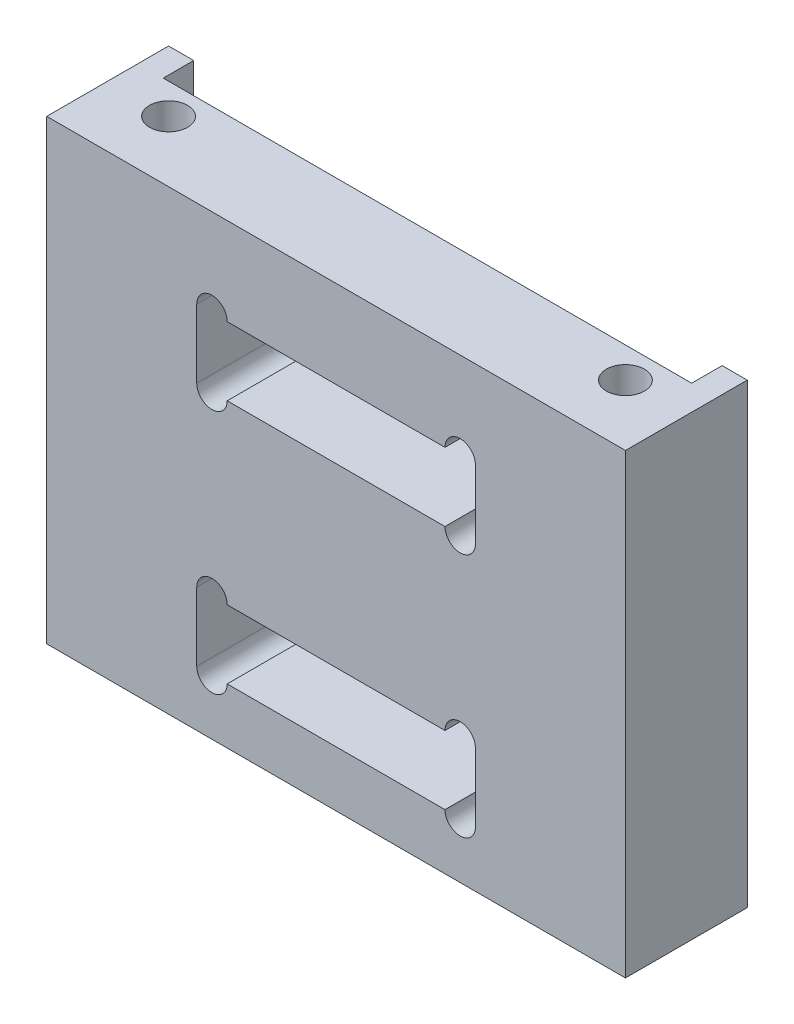
ISO-10303-21;
HEADER;
FILE_DESCRIPTION(('STEP AP214'),'2;1');
FILE_NAME('part.step','',(''),(''),'','','');
FILE_SCHEMA(('AUTOMOTIVE_DESIGN { 1 0 10303 214 1 1 1 1 }'));
ENDSEC;
DATA;
#1=APPLICATION_CONTEXT('core data for automotive mechanical design processes');
#2=APPLICATION_PROTOCOL_DEFINITION('international standard','automotive_design',2000,#1);
#3=PRODUCT_CONTEXT('',#1,'mechanical');
#4=PRODUCT('Part','Part','',(#3));
#5=PRODUCT_RELATED_PRODUCT_CATEGORY('part','',(#4));
#6=PRODUCT_DEFINITION_FORMATION('','',#4);
#7=PRODUCT_DEFINITION_CONTEXT('part definition',#1,'design');
#8=PRODUCT_DEFINITION('design','',#6,#7);
#9=PRODUCT_DEFINITION_SHAPE('','',#8);
#10=(LENGTH_UNIT() NAMED_UNIT(*) SI_UNIT(.MILLI.,.METRE.));
#11=(NAMED_UNIT(*) PLANE_ANGLE_UNIT() SI_UNIT($,.RADIAN.));
#12=(NAMED_UNIT(*) SI_UNIT($,.STERADIAN.) SOLID_ANGLE_UNIT());
#13=UNCERTAINTY_MEASURE_WITH_UNIT(LENGTH_MEASURE(1.E-05),#10,'distance_accuracy_value','');
#14=(GEOMETRIC_REPRESENTATION_CONTEXT(3) GLOBAL_UNCERTAINTY_ASSIGNED_CONTEXT((#13)) GLOBAL_UNIT_ASSIGNED_CONTEXT((#10,
#11,#12)) REPRESENTATION_CONTEXT('',''));
#15=CARTESIAN_POINT('',(0.,0.,0.));
#16=DIRECTION('',(0.,0.,1.));
#17=DIRECTION('',(1.,0.,0.));
#18=AXIS2_PLACEMENT_3D('',#15,#16,#17);
#19=CARTESIAN_POINT('',(19.,-15.,4.));
#20=DIRECTION('',(0.,1.,0.));
#21=DIRECTION('',(-1.,0.,0.));
#22=AXIS2_PLACEMENT_3D('',#19,#20,#21);
#23=PLANE('',#22);
#24=CARTESIAN_POINT('',(-14.5,-15.,0.));
#25=DIRECTION('',(0.,-1.,0.));
#26=DIRECTION('',(0.,0.,-1.));
#27=AXIS2_PLACEMENT_3D('',#24,#25,#26);
#28=CIRCLE('',#27,1.25);
#29=CARTESIAN_POINT('',(-14.5,-15.,-1.25));
#30=VERTEX_POINT('',#29);
#31=EDGE_CURVE('E235',#30,#30,#28,.T.);
#32=ORIENTED_EDGE('',*,*,#31,.F.);
#33=EDGE_LOOP('',(#32));
#34=FACE_BOUND('',#33,.T.);
#35=CARTESIAN_POINT('',(14.5,-15.,0.));
#36=DIRECTION('',(0.,-1.,0.));
#37=DIRECTION('',(0.,0.,-1.));
#38=AXIS2_PLACEMENT_3D('',#35,#36,#37);
#39=CIRCLE('',#38,1.25);
#40=CARTESIAN_POINT('',(14.5,-15.,-1.25));
#41=VERTEX_POINT('',#40);
#42=EDGE_CURVE('E241',#41,#41,#39,.T.);
#43=ORIENTED_EDGE('',*,*,#42,.F.);
#44=EDGE_LOOP('',(#43));
#45=FACE_BOUND('',#44,.T.);
#46=DIRECTION('',(0.,0.,-1.));
#47=VECTOR('',#46,1.);
#48=CARTESIAN_POINT('',(17.35,-15.,-2.));
#49=LINE('',#48,#47);
#50=CARTESIAN_POINT('',(17.35,-15.,-2.));
#51=VERTEX_POINT('',#50);
#52=CARTESIAN_POINT('',(17.35,-15.,-4.));
#53=VERTEX_POINT('',#52);
#54=EDGE_CURVE('E380',#51,#53,#49,.T.);
#55=ORIENTED_EDGE('',*,*,#54,.T.);
#56=DIRECTION('',(1.,0.,0.));
#57=VECTOR('',#56,1.);
#58=CARTESIAN_POINT('',(19.,-15.,-4.));
#59=LINE('',#58,#57);
#60=CARTESIAN_POINT('',(19.,-15.,-4.));
#61=VERTEX_POINT('',#60);
#62=EDGE_CURVE('E405',#53,#61,#59,.T.);
#63=ORIENTED_EDGE('',*,*,#62,.T.);
#64=DIRECTION('',(0.,0.,-1.));
#65=VECTOR('',#64,1.);
#66=CARTESIAN_POINT('',(19.,-15.,4.));
#67=LINE('',#66,#65);
#68=CARTESIAN_POINT('',(19.,-15.,4.));
#69=VERTEX_POINT('',#68);
#70=EDGE_CURVE('E419',#69,#61,#67,.T.);
#71=ORIENTED_EDGE('',*,*,#70,.F.);
#72=DIRECTION('',(1.,0.,0.));
#73=VECTOR('',#72,1.);
#74=CARTESIAN_POINT('',(19.,-15.,4.));
#75=LINE('',#74,#73);
#76=CARTESIAN_POINT('',(-19.,-15.,4.));
#77=VERTEX_POINT('',#76);
#78=EDGE_CURVE('E395',#77,#69,#75,.T.);
#79=ORIENTED_EDGE('',*,*,#78,.F.);
#80=DIRECTION('',(0.,0.,-1.));
#81=VECTOR('',#80,1.);
#82=CARTESIAN_POINT('',(-19.,-15.,4.));
#83=LINE('',#82,#81);
#84=CARTESIAN_POINT('',(-19.,-15.,-4.));
#85=VERTEX_POINT('',#84);
#86=EDGE_CURVE('E422',#77,#85,#83,.T.);
#87=ORIENTED_EDGE('',*,*,#86,.T.);
#88=CARTESIAN_POINT('',(-17.35,-15.,-4.));
#89=VERTEX_POINT('',#88);
#90=EDGE_CURVE('E406',#85,#89,#59,.T.);
#91=ORIENTED_EDGE('',*,*,#90,.T.);
#92=DIRECTION('',(0.,0.,-1.));
#93=VECTOR('',#92,1.);
#94=CARTESIAN_POINT('',(-17.35,-15.,-2.));
#95=LINE('',#94,#93);
#96=CARTESIAN_POINT('',(-17.35,-15.,-2.));
#97=VERTEX_POINT('',#96);
#98=EDGE_CURVE('E385',#97,#89,#95,.T.);
#99=ORIENTED_EDGE('',*,*,#98,.F.);
#100=DIRECTION('',(1.,0.,0.));
#101=VECTOR('',#100,1.);
#102=CARTESIAN_POINT('',(17.35,-15.,-2.));
#103=LINE('',#102,#101);
#104=EDGE_CURVE('E374',#97,#51,#103,.T.);
#105=ORIENTED_EDGE('',*,*,#104,.T.);
#106=EDGE_LOOP('',(#55,#63,#71,#79,#87,#91,#99,#105));
#107=FACE_BOUND('',#106,.T.);
#108=ADVANCED_FACE('F44',(#34,#45,#107),#23,.F.);
#109=CARTESIAN_POINT('',(19.,15.,4.));
#110=DIRECTION('',(0.,-1.,0.));
#111=DIRECTION('',(1.,0.,0.));
#112=AXIS2_PLACEMENT_3D('',#109,#110,#111);
#113=PLANE('',#112);
#114=CARTESIAN_POINT('',(15.,15.,0.));
#115=DIRECTION('',(0.,1.,0.));
#116=DIRECTION('',(0.,0.,1.));
#117=AXIS2_PLACEMENT_3D('',#114,#115,#116);
#118=CIRCLE('',#117,1.25);
#119=CARTESIAN_POINT('',(15.,15.,1.25));
#120=VERTEX_POINT('',#119);
#121=EDGE_CURVE('E225',#120,#120,#118,.T.);
#122=ORIENTED_EDGE('',*,*,#121,.F.);
#123=EDGE_LOOP('',(#122));
#124=FACE_BOUND('',#123,.T.);
#125=CARTESIAN_POINT('',(-15.,15.,0.));
#126=DIRECTION('',(0.,1.,0.));
#127=DIRECTION('',(0.,0.,1.));
#128=AXIS2_PLACEMENT_3D('',#125,#126,#127);
#129=CIRCLE('',#128,1.25);
#130=CARTESIAN_POINT('',(-15.,15.,1.25));
#131=VERTEX_POINT('',#130);
#132=EDGE_CURVE('E224',#131,#131,#129,.T.);
#133=ORIENTED_EDGE('',*,*,#132,.F.);
#134=EDGE_LOOP('',(#133));
#135=FACE_BOUND('',#134,.T.);
#136=DIRECTION('',(0.,0.,-1.));
#137=VECTOR('',#136,1.);
#138=CARTESIAN_POINT('',(17.35,15.,4.));
#139=LINE('',#138,#137);
#140=CARTESIAN_POINT('',(17.35,15.,-2.));
#141=VERTEX_POINT('',#140);
#142=CARTESIAN_POINT('',(17.35,15.,-4.));
#143=VERTEX_POINT('',#142);
#144=EDGE_CURVE('E389',#141,#143,#139,.T.);
#145=ORIENTED_EDGE('',*,*,#144,.F.);
#146=DIRECTION('',(1.,0.,0.));
#147=VECTOR('',#146,1.);
#148=CARTESIAN_POINT('',(19.,15.,-2.));
#149=LINE('',#148,#147);
#150=CARTESIAN_POINT('',(-17.35,15.,-2.));
#151=VERTEX_POINT('',#150);
#152=EDGE_CURVE('E11',#151,#141,#149,.T.);
#153=ORIENTED_EDGE('',*,*,#152,.F.);
#154=DIRECTION('',(0.,0.,1.));
#155=VECTOR('',#154,1.);
#156=CARTESIAN_POINT('',(-17.35,15.,4.));
#157=LINE('',#156,#155);
#158=CARTESIAN_POINT('',(-17.35,15.,-4.));
#159=VERTEX_POINT('',#158);
#160=EDGE_CURVE('E387',#159,#151,#157,.T.);
#161=ORIENTED_EDGE('',*,*,#160,.F.);
#162=DIRECTION('',(-1.,0.,0.));
#163=VECTOR('',#162,1.);
#164=CARTESIAN_POINT('',(19.,15.,-4.));
#165=LINE('',#164,#163);
#166=CARTESIAN_POINT('',(-19.,15.,-4.));
#167=VERTEX_POINT('',#166);
#168=EDGE_CURVE('E411',#159,#167,#165,.T.);
#169=ORIENTED_EDGE('',*,*,#168,.T.);
#170=DIRECTION('',(0.,0.,-1.));
#171=VECTOR('',#170,1.);
#172=CARTESIAN_POINT('',(-19.,15.,4.));
#173=LINE('',#172,#171);
#174=CARTESIAN_POINT('',(-19.,15.,4.));
#175=VERTEX_POINT('',#174);
#176=EDGE_CURVE('E402',#175,#167,#173,.T.);
#177=ORIENTED_EDGE('',*,*,#176,.F.);
#178=DIRECTION('',(-1.,0.,0.));
#179=VECTOR('',#178,1.);
#180=CARTESIAN_POINT('',(19.,15.,4.));
#181=LINE('',#180,#179);
#182=CARTESIAN_POINT('',(19.,15.,4.));
#183=VERTEX_POINT('',#182);
#184=EDGE_CURVE('E400',#183,#175,#181,.T.);
#185=ORIENTED_EDGE('',*,*,#184,.F.);
#186=DIRECTION('',(0.,0.,-1.));
#187=VECTOR('',#186,1.);
#188=CARTESIAN_POINT('',(19.,15.,4.));
#189=LINE('',#188,#187);
#190=CARTESIAN_POINT('',(19.,15.,-4.));
#191=VERTEX_POINT('',#190);
#192=EDGE_CURVE('E416',#183,#191,#189,.T.);
#193=ORIENTED_EDGE('',*,*,#192,.T.);
#194=EDGE_CURVE('E396',#191,#143,#165,.T.);
#195=ORIENTED_EDGE('',*,*,#194,.T.);
#196=EDGE_LOOP('',(#145,#153,#161,#169,#177,#185,#193,#195));
#197=FACE_BOUND('',#196,.T.);
#198=ADVANCED_FACE('F435',(#124,#135,#197),#113,.F.);
#199=CARTESIAN_POINT('',(0.,0.,-4.));
#200=DIRECTION('',(0.,0.,1.));
#201=DIRECTION('',(1.,0.,0.));
#202=AXIS2_PLACEMENT_3D('',#199,#200,#201);
#203=PLANE('',#202);
#204=DIRECTION('',(0.,1.,0.));
#205=VECTOR('',#204,1.);
#206=CARTESIAN_POINT('',(17.35,15.5,-4.));
#207=LINE('',#206,#205);
#208=EDGE_CURVE('E297',#53,#143,#207,.T.);
#209=ORIENTED_EDGE('',*,*,#208,.T.);
#210=ORIENTED_EDGE('',*,*,#194,.F.);
#211=DIRECTION('',(0.,1.,0.));
#212=VECTOR('',#211,1.);
#213=CARTESIAN_POINT('',(19.,-15.,-4.));
#214=LINE('',#213,#212);
#215=EDGE_CURVE('E409',#61,#191,#214,.T.);
#216=ORIENTED_EDGE('',*,*,#215,.F.);
#217=ORIENTED_EDGE('',*,*,#62,.F.);
#218=EDGE_LOOP('',(#209,#210,#216,#217));
#219=FACE_BOUND('',#218,.T.);
#220=ADVANCED_FACE('F454',(#219),#203,.F.);
#221=DIRECTION('',(0.,1.,0.));
#222=VECTOR('',#221,1.);
#223=CARTESIAN_POINT('',(-17.35,0.,-4.));
#224=LINE('',#223,#222);
#225=EDGE_CURVE('E52',#89,#159,#224,.T.);
#226=ORIENTED_EDGE('',*,*,#225,.F.);
#227=ORIENTED_EDGE('',*,*,#90,.F.);
#228=DIRECTION('',(0.,-1.,0.));
#229=VECTOR('',#228,1.);
#230=CARTESIAN_POINT('',(-19.,-15.,-4.));
#231=LINE('',#230,#229);
#232=EDGE_CURVE('E391',#167,#85,#231,.T.);
#233=ORIENTED_EDGE('',*,*,#232,.F.);
#234=ORIENTED_EDGE('',*,*,#168,.F.);
#235=EDGE_LOOP('',(#226,#227,#233,#234));
#236=FACE_BOUND('',#235,.T.);
#237=ADVANCED_FACE('F438',(#236),#203,.F.);
#238=CARTESIAN_POINT('',(-19.,-15.,4.));
#239=DIRECTION('',(1.,0.,0.));
#240=DIRECTION('',(0.,0.,-1.));
#241=AXIS2_PLACEMENT_3D('',#238,#239,#240);
#242=PLANE('',#241);
#243=ORIENTED_EDGE('',*,*,#232,.T.);
#244=ORIENTED_EDGE('',*,*,#86,.F.);
#245=DIRECTION('',(0.,-1.,0.));
#246=VECTOR('',#245,1.);
#247=CARTESIAN_POINT('',(-19.,-15.,4.));
#248=LINE('',#247,#246);
#249=EDGE_CURVE('E392',#175,#77,#248,.T.);
#250=ORIENTED_EDGE('',*,*,#249,.F.);
#251=ORIENTED_EDGE('',*,*,#176,.T.);
#252=EDGE_LOOP('',(#243,#244,#250,#251));
#253=FACE_BOUND('',#252,.T.);
#254=ADVANCED_FACE('F46',(#253),#242,.F.);
#255=CARTESIAN_POINT('',(19.,-15.,4.));
#256=DIRECTION('',(-1.,0.,0.));
#257=DIRECTION('',(0.,0.,1.));
#258=AXIS2_PLACEMENT_3D('',#255,#256,#257);
#259=PLANE('',#258);
#260=ORIENTED_EDGE('',*,*,#215,.T.);
#261=ORIENTED_EDGE('',*,*,#192,.F.);
#262=DIRECTION('',(0.,1.,0.));
#263=VECTOR('',#262,1.);
#264=CARTESIAN_POINT('',(19.,-15.,4.));
#265=LINE('',#264,#263);
#266=EDGE_CURVE('E398',#69,#183,#265,.T.);
#267=ORIENTED_EDGE('',*,*,#266,.F.);
#268=ORIENTED_EDGE('',*,*,#70,.T.);
#269=EDGE_LOOP('',(#260,#261,#267,#268));
#270=FACE_BOUND('',#269,.T.);
#271=ADVANCED_FACE('F450',(#270),#259,.F.);
#272=CARTESIAN_POINT('',(0.,0.,4.));
#273=DIRECTION('',(0.,0.,1.));
#274=DIRECTION('',(1.,0.,0.));
#275=AXIS2_PLACEMENT_3D('',#272,#273,#274);
#276=PLANE('',#275);
#277=CARTESIAN_POINT('',(-8.15,-6.85000000000001,4.));
#278=DIRECTION('',(0.,0.,-1.));
#279=DIRECTION('',(-1.,0.,0.));
#280=AXIS2_PLACEMENT_3D('',#277,#278,#279);
#281=CIRCLE('',#280,0.999999999999997);
#282=CARTESIAN_POINT('',(-9.15,-6.85000000000001,4.));
#283=VERTEX_POINT('',#282);
#284=CARTESIAN_POINT('',(-7.15,-6.85000000000001,4.));
#285=VERTEX_POINT('',#284);
#286=EDGE_CURVE('E248',#283,#285,#281,.T.);
#287=ORIENTED_EDGE('',*,*,#286,.T.);
#288=DIRECTION('',(1.,0.,0.));
#289=VECTOR('',#288,1.);
#290=CARTESIAN_POINT('',(7.15000000000001,-6.85000000000001,4.));
#291=LINE('',#290,#289);
#292=CARTESIAN_POINT('',(7.15000000000001,-6.85000000000001,4.));
#293=VERTEX_POINT('',#292);
#294=EDGE_CURVE('E251',#285,#293,#291,.T.);
#295=ORIENTED_EDGE('',*,*,#294,.T.);
#296=CARTESIAN_POINT('',(8.15,-6.85000000000001,4.));
#297=DIRECTION('',(0.,0.,-1.));
#298=DIRECTION('',(1.,0.,0.));
#299=AXIS2_PLACEMENT_3D('',#296,#297,#298);
#300=CIRCLE('',#299,0.999999999999996);
#301=CARTESIAN_POINT('',(9.15,-6.85000000000001,4.));
#302=VERTEX_POINT('',#301);
#303=EDGE_CURVE('E59',#293,#302,#300,.T.);
#304=ORIENTED_EDGE('',*,*,#303,.T.);
#305=DIRECTION('',(0.,-1.,0.));
#306=VECTOR('',#305,1.);
#307=CARTESIAN_POINT('',(9.15,-11.35,4.));
#308=LINE('',#307,#306);
#309=CARTESIAN_POINT('',(9.15,-11.35,4.));
#310=VERTEX_POINT('',#309);
#311=EDGE_CURVE('E256',#302,#310,#308,.T.);
#312=ORIENTED_EDGE('',*,*,#311,.T.);
#313=CARTESIAN_POINT('',(8.15,-11.35,4.));
#314=DIRECTION('',(0.,0.,-1.));
#315=DIRECTION('',(-1.,0.,0.));
#316=AXIS2_PLACEMENT_3D('',#313,#314,#315);
#317=CIRCLE('',#316,0.999999999999996);
#318=CARTESIAN_POINT('',(7.15000000000001,-11.35,4.));
#319=VERTEX_POINT('',#318);
#320=EDGE_CURVE('E259',#310,#319,#317,.T.);
#321=ORIENTED_EDGE('',*,*,#320,.T.);
#322=DIRECTION('',(-1.,0.,0.));
#323=VECTOR('',#322,1.);
#324=CARTESIAN_POINT('',(-7.15,-11.35,4.));
#325=LINE('',#324,#323);
#326=CARTESIAN_POINT('',(-7.15,-11.35,4.));
#327=VERTEX_POINT('',#326);
#328=EDGE_CURVE('E262',#319,#327,#325,.T.);
#329=ORIENTED_EDGE('',*,*,#328,.T.);
#330=CARTESIAN_POINT('',(-8.15,-11.35,4.));
#331=DIRECTION('',(0.,0.,-1.));
#332=DIRECTION('',(1.,0.,0.));
#333=AXIS2_PLACEMENT_3D('',#330,#331,#332);
#334=CIRCLE('',#333,0.999999999999997);
#335=CARTESIAN_POINT('',(-9.15,-11.35,4.));
#336=VERTEX_POINT('',#335);
#337=EDGE_CURVE('E265',#327,#336,#334,.T.);
#338=ORIENTED_EDGE('',*,*,#337,.T.);
#339=DIRECTION('',(0.,1.,0.));
#340=VECTOR('',#339,1.);
#341=CARTESIAN_POINT('',(-9.15,-6.85000000000001,4.));
#342=LINE('',#341,#340);
#343=EDGE_CURVE('E268',#336,#283,#342,.T.);
#344=ORIENTED_EDGE('',*,*,#343,.T.);
#345=EDGE_LOOP('',(#287,#295,#304,#312,#321,#329,#338,#344));
#346=FACE_BOUND('',#345,.T.);
#347=CARTESIAN_POINT('',(-8.15,9.24999999999999,4.));
#348=DIRECTION('',(0.,0.,-1.));
#349=DIRECTION('',(-1.,0.,0.));
#350=AXIS2_PLACEMENT_3D('',#347,#348,#349);
#351=CIRCLE('',#350,1.);
#352=CARTESIAN_POINT('',(-9.15,9.24999999999999,4.));
#353=VERTEX_POINT('',#352);
#354=CARTESIAN_POINT('',(-7.15,9.24999999999999,4.));
#355=VERTEX_POINT('',#354);
#356=EDGE_CURVE('E333',#353,#355,#351,.T.);
#357=ORIENTED_EDGE('',*,*,#356,.T.);
#358=DIRECTION('',(1.,0.,0.));
#359=VECTOR('',#358,1.);
#360=CARTESIAN_POINT('',(7.15,9.24999999999999,4.));
#361=LINE('',#360,#359);
#362=CARTESIAN_POINT('',(7.15,9.24999999999999,4.));
#363=VERTEX_POINT('',#362);
#364=EDGE_CURVE('E367',#355,#363,#361,.T.);
#365=ORIENTED_EDGE('',*,*,#364,.T.);
#366=CARTESIAN_POINT('',(8.15,9.24999999999999,4.));
#367=DIRECTION('',(0.,0.,-1.));
#368=DIRECTION('',(1.,0.,0.));
#369=AXIS2_PLACEMENT_3D('',#366,#367,#368);
#370=CIRCLE('',#369,1.);
#371=CARTESIAN_POINT('',(9.15,9.24999999999999,4.));
#372=VERTEX_POINT('',#371);
#373=EDGE_CURVE('E67',#363,#372,#370,.T.);
#374=ORIENTED_EDGE('',*,*,#373,.T.);
#375=DIRECTION('',(0.,-1.,0.));
#376=VECTOR('',#375,1.);
#377=CARTESIAN_POINT('',(9.15,4.74999999999999,4.));
#378=LINE('',#377,#376);
#379=CARTESIAN_POINT('',(9.15,4.74999999999999,4.));
#380=VERTEX_POINT('',#379);
#381=EDGE_CURVE('E363',#372,#380,#378,.T.);
#382=ORIENTED_EDGE('',*,*,#381,.T.);
#383=CARTESIAN_POINT('',(8.15,4.74999999999999,4.));
#384=DIRECTION('',(0.,0.,-1.));
#385=DIRECTION('',(-1.,0.,0.));
#386=AXIS2_PLACEMENT_3D('',#383,#384,#385);
#387=CIRCLE('',#386,0.999999999999999);
#388=CARTESIAN_POINT('',(7.15,4.74999999999999,4.));
#389=VERTEX_POINT('',#388);
#390=EDGE_CURVE('E360',#380,#389,#387,.T.);
#391=ORIENTED_EDGE('',*,*,#390,.T.);
#392=DIRECTION('',(-1.,0.,0.));
#393=VECTOR('',#392,1.);
#394=CARTESIAN_POINT('',(-7.15,4.74999999999999,4.));
#395=LINE('',#394,#393);
#396=CARTESIAN_POINT('',(-7.15,4.74999999999999,4.));
#397=VERTEX_POINT('',#396);
#398=EDGE_CURVE('E357',#389,#397,#395,.T.);
#399=ORIENTED_EDGE('',*,*,#398,.T.);
#400=CARTESIAN_POINT('',(-8.15,4.74999999999999,4.));
#401=DIRECTION('',(0.,0.,-1.));
#402=DIRECTION('',(1.,0.,0.));
#403=AXIS2_PLACEMENT_3D('',#400,#401,#402);
#404=CIRCLE('',#403,0.999999999999999);
#405=CARTESIAN_POINT('',(-9.15,4.74999999999999,4.));
#406=VERTEX_POINT('',#405);
#407=EDGE_CURVE('E354',#397,#406,#404,.T.);
#408=ORIENTED_EDGE('',*,*,#407,.T.);
#409=DIRECTION('',(0.,1.,0.));
#410=VECTOR('',#409,1.);
#411=CARTESIAN_POINT('',(-9.15,9.24999999999999,4.));
#412=LINE('',#411,#410);
#413=EDGE_CURVE('E315',#406,#353,#412,.T.);
#414=ORIENTED_EDGE('',*,*,#413,.T.);
#415=EDGE_LOOP('',(#357,#365,#374,#382,#391,#399,#408,#414));
#416=FACE_BOUND('',#415,.T.);
#417=ORIENTED_EDGE('',*,*,#249,.T.);
#418=ORIENTED_EDGE('',*,*,#78,.T.);
#419=ORIENTED_EDGE('',*,*,#266,.T.);
#420=ORIENTED_EDGE('',*,*,#184,.T.);
#421=EDGE_LOOP('',(#417,#418,#419,#420));
#422=FACE_BOUND('',#421,.T.);
#423=ADVANCED_FACE('F446',(#346,#416,#422),#276,.T.);
#424=CARTESIAN_POINT('',(15.85,15.5,-2.));
#425=DIRECTION('',(0.,0.,-1.));
#426=DIRECTION('',(-1.,0.,0.));
#427=AXIS2_PLACEMENT_3D('',#424,#425,#426);
#428=PLANE('',#427);
#429=CARTESIAN_POINT('',(-8.15,-6.85000000000001,-2.));
#430=DIRECTION('',(0.,0.,-1.));
#431=DIRECTION('',(-1.,0.,0.));
#432=AXIS2_PLACEMENT_3D('',#429,#430,#431);
#433=CIRCLE('',#432,0.999999999999997);
#434=CARTESIAN_POINT('',(-9.15,-6.85000000000001,-2.));
#435=VERTEX_POINT('',#434);
#436=CARTESIAN_POINT('',(-7.15,-6.85,-2.));
#437=VERTEX_POINT('',#436);
#438=EDGE_CURVE('E272',#435,#437,#433,.T.);
#439=ORIENTED_EDGE('',*,*,#438,.F.);
#440=DIRECTION('',(0.,1.,0.));
#441=VECTOR('',#440,1.);
#442=CARTESIAN_POINT('',(-9.15,-6.85000000000001,-2.));
#443=LINE('',#442,#441);
#444=CARTESIAN_POINT('',(-9.15,-11.35,-2.));
#445=VERTEX_POINT('',#444);
#446=EDGE_CURVE('E252',#445,#435,#443,.T.);
#447=ORIENTED_EDGE('',*,*,#446,.F.);
#448=CARTESIAN_POINT('',(-8.15,-11.35,-2.));
#449=DIRECTION('',(0.,0.,-1.));
#450=DIRECTION('',(1.,0.,0.));
#451=AXIS2_PLACEMENT_3D('',#448,#449,#450);
#452=CIRCLE('',#451,0.999999999999997);
#453=CARTESIAN_POINT('',(-7.15,-11.35,-2.));
#454=VERTEX_POINT('',#453);
#455=EDGE_CURVE('E290',#454,#445,#452,.T.);
#456=ORIENTED_EDGE('',*,*,#455,.F.);
#457=DIRECTION('',(-1.,0.,0.));
#458=VECTOR('',#457,1.);
#459=CARTESIAN_POINT('',(-7.15,-11.35,-2.));
#460=LINE('',#459,#458);
#461=CARTESIAN_POINT('',(7.15000000000001,-11.35,-2.));
#462=VERTEX_POINT('',#461);
#463=EDGE_CURVE('E287',#462,#454,#460,.T.);
#464=ORIENTED_EDGE('',*,*,#463,.F.);
#465=CARTESIAN_POINT('',(8.15,-11.35,-2.));
#466=DIRECTION('',(0.,0.,-1.));
#467=DIRECTION('',(-1.,0.,0.));
#468=AXIS2_PLACEMENT_3D('',#465,#466,#467);
#469=CIRCLE('',#468,0.999999999999996);
#470=CARTESIAN_POINT('',(9.15,-11.35,-2.));
#471=VERTEX_POINT('',#470);
#472=EDGE_CURVE('E284',#471,#462,#469,.T.);
#473=ORIENTED_EDGE('',*,*,#472,.F.);
#474=DIRECTION('',(0.,-1.,0.));
#475=VECTOR('',#474,1.);
#476=CARTESIAN_POINT('',(9.15,-11.35,-2.));
#477=LINE('',#476,#475);
#478=CARTESIAN_POINT('',(9.15,-6.85000000000001,-2.));
#479=VERTEX_POINT('',#478);
#480=EDGE_CURVE('E281',#479,#471,#477,.T.);
#481=ORIENTED_EDGE('',*,*,#480,.F.);
#482=CARTESIAN_POINT('',(8.15,-6.85000000000001,-2.));
#483=DIRECTION('',(0.,0.,-1.));
#484=DIRECTION('',(1.,0.,0.));
#485=AXIS2_PLACEMENT_3D('',#482,#483,#484);
#486=CIRCLE('',#485,0.999999999999996);
#487=CARTESIAN_POINT('',(7.15000000000001,-6.85000000000001,-2.));
#488=VERTEX_POINT('',#487);
#489=EDGE_CURVE('E278',#488,#479,#486,.T.);
#490=ORIENTED_EDGE('',*,*,#489,.F.);
#491=DIRECTION('',(1.,0.,0.));
#492=VECTOR('',#491,1.);
#493=CARTESIAN_POINT('',(7.15000000000001,-6.85000000000001,-2.));
#494=LINE('',#493,#492);
#495=EDGE_CURVE('E274',#437,#488,#494,.T.);
#496=ORIENTED_EDGE('',*,*,#495,.F.);
#497=EDGE_LOOP('',(#439,#447,#456,#464,#473,#481,#490,#496));
#498=FACE_BOUND('',#497,.T.);
#499=CARTESIAN_POINT('',(-8.15,9.24999999999999,-2.));
#500=DIRECTION('',(0.,0.,-1.));
#501=DIRECTION('',(-1.,0.,0.));
#502=AXIS2_PLACEMENT_3D('',#499,#500,#501);
#503=CIRCLE('',#502,1.);
#504=CARTESIAN_POINT('',(-9.15,9.24999999999999,-2.));
#505=VERTEX_POINT('',#504);
#506=CARTESIAN_POINT('',(-7.15,9.24999999999999,-2.));
#507=VERTEX_POINT('',#506);
#508=EDGE_CURVE('E275',#505,#507,#503,.T.);
#509=ORIENTED_EDGE('',*,*,#508,.F.);
#510=DIRECTION('',(0.,1.,0.));
#511=VECTOR('',#510,1.);
#512=CARTESIAN_POINT('',(-9.15,9.24999999999999,-2.));
#513=LINE('',#512,#511);
#514=CARTESIAN_POINT('',(-9.15,4.74999999999999,-2.));
#515=VERTEX_POINT('',#514);
#516=EDGE_CURVE('E329',#515,#505,#513,.T.);
#517=ORIENTED_EDGE('',*,*,#516,.F.);
#518=CARTESIAN_POINT('',(-8.15,4.74999999999999,-2.));
#519=DIRECTION('',(0.,0.,-1.));
#520=DIRECTION('',(1.,0.,0.));
#521=AXIS2_PLACEMENT_3D('',#518,#519,#520);
#522=CIRCLE('',#521,0.999999999999999);
#523=CARTESIAN_POINT('',(-7.15,4.74999999999999,-2.));
#524=VERTEX_POINT('',#523);
#525=EDGE_CURVE('E332',#524,#515,#522,.T.);
#526=ORIENTED_EDGE('',*,*,#525,.F.);
#527=DIRECTION('',(-1.,0.,0.));
#528=VECTOR('',#527,1.);
#529=CARTESIAN_POINT('',(-7.15,4.74999999999999,-2.));
#530=LINE('',#529,#528);
#531=CARTESIAN_POINT('',(7.15,4.74999999999999,-2.));
#532=VERTEX_POINT('',#531);
#533=EDGE_CURVE('E336',#532,#524,#530,.T.);
#534=ORIENTED_EDGE('',*,*,#533,.F.);
#535=CARTESIAN_POINT('',(8.15,4.74999999999999,-2.));
#536=DIRECTION('',(0.,0.,-1.));
#537=DIRECTION('',(-1.,0.,0.));
#538=AXIS2_PLACEMENT_3D('',#535,#536,#537);
#539=CIRCLE('',#538,0.999999999999999);
#540=CARTESIAN_POINT('',(9.15,4.74999999999999,-2.));
#541=VERTEX_POINT('',#540);
#542=EDGE_CURVE('E339',#541,#532,#539,.T.);
#543=ORIENTED_EDGE('',*,*,#542,.F.);
#544=DIRECTION('',(0.,-1.,0.));
#545=VECTOR('',#544,1.);
#546=CARTESIAN_POINT('',(9.15,4.74999999999999,-2.));
#547=LINE('',#546,#545);
#548=CARTESIAN_POINT('',(9.15,9.24999999999999,-2.));
#549=VERTEX_POINT('',#548);
#550=EDGE_CURVE('E342',#549,#541,#547,.T.);
#551=ORIENTED_EDGE('',*,*,#550,.F.);
#552=CARTESIAN_POINT('',(8.15,9.24999999999999,-2.));
#553=DIRECTION('',(0.,0.,-1.));
#554=DIRECTION('',(1.,0.,0.));
#555=AXIS2_PLACEMENT_3D('',#552,#553,#554);
#556=CIRCLE('',#555,1.);
#557=CARTESIAN_POINT('',(7.15,9.24999999999999,-2.));
#558=VERTEX_POINT('',#557);
#559=EDGE_CURVE('E345',#558,#549,#556,.T.);
#560=ORIENTED_EDGE('',*,*,#559,.F.);
#561=DIRECTION('',(1.,0.,0.));
#562=VECTOR('',#561,1.);
#563=CARTESIAN_POINT('',(7.15,9.24999999999999,-2.));
#564=LINE('',#563,#562);
#565=EDGE_CURVE('E348',#507,#558,#564,.T.);
#566=ORIENTED_EDGE('',*,*,#565,.F.);
#567=EDGE_LOOP('',(#509,#517,#526,#534,#543,#551,#560,#566));
#568=FACE_BOUND('',#567,.T.);
#569=ORIENTED_EDGE('',*,*,#152,.T.);
#570=DIRECTION('',(0.,1.,0.));
#571=VECTOR('',#570,1.);
#572=CARTESIAN_POINT('',(17.35,-13.2,-2.));
#573=LINE('',#572,#571);
#574=EDGE_CURVE('E377',#51,#141,#573,.T.);
#575=ORIENTED_EDGE('',*,*,#574,.F.);
#576=ORIENTED_EDGE('',*,*,#104,.F.);
#577=DIRECTION('',(0.,-1.,0.));
#578=VECTOR('',#577,1.);
#579=CARTESIAN_POINT('',(-17.35,-1.50000000000001,-2.));
#580=LINE('',#579,#578);
#581=EDGE_CURVE('E372',#151,#97,#580,.T.);
#582=ORIENTED_EDGE('',*,*,#581,.F.);
#583=EDGE_LOOP('',(#569,#575,#576,#582));
#584=FACE_BOUND('',#583,.T.);
#585=ADVANCED_FACE('F460',(#498,#568,#584),#428,.T.);
#586=CARTESIAN_POINT('',(17.35,15.5,-2.));
#587=DIRECTION('',(-1.,0.,0.));
#588=DIRECTION('',(0.,0.,1.));
#589=AXIS2_PLACEMENT_3D('',#586,#587,#588);
#590=PLANE('',#589);
#591=ORIENTED_EDGE('',*,*,#144,.T.);
#592=ORIENTED_EDGE('',*,*,#208,.F.);
#593=ORIENTED_EDGE('',*,*,#54,.F.);
#594=ORIENTED_EDGE('',*,*,#574,.T.);
#595=EDGE_LOOP('',(#591,#592,#593,#594));
#596=FACE_BOUND('',#595,.T.);
#597=ADVANCED_FACE('F456',(#596),#590,.T.);
#598=CARTESIAN_POINT('',(-17.35,-1.50000000000001,-2.));
#599=DIRECTION('',(1.,0.,0.));
#600=DIRECTION('',(0.,0.,-1.));
#601=AXIS2_PLACEMENT_3D('',#598,#599,#600);
#602=PLANE('',#601);
#603=ORIENTED_EDGE('',*,*,#160,.T.);
#604=ORIENTED_EDGE('',*,*,#581,.T.);
#605=ORIENTED_EDGE('',*,*,#98,.T.);
#606=ORIENTED_EDGE('',*,*,#225,.T.);
#607=EDGE_LOOP('',(#603,#604,#605,#606));
#608=FACE_BOUND('',#607,.T.);
#609=ADVANCED_FACE('F427',(#608),#602,.T.);
#610=CARTESIAN_POINT('',(-8.15,9.24999999999999,4.));
#611=DIRECTION('',(0.,0.,-1.));
#612=DIRECTION('',(-1.,0.,0.));
#613=AXIS2_PLACEMENT_3D('',#610,#611,#612);
#614=CYLINDRICAL_SURFACE('',#613,1.);
#615=ORIENTED_EDGE('',*,*,#508,.T.);
#616=DIRECTION('',(0.,0.,-1.));
#617=VECTOR('',#616,1.);
#618=CARTESIAN_POINT('',(-7.15,9.24999999999999,4.));
#619=LINE('',#618,#617);
#620=EDGE_CURVE('E312',#355,#507,#619,.T.);
#621=ORIENTED_EDGE('',*,*,#620,.F.);
#622=ORIENTED_EDGE('',*,*,#356,.F.);
#623=DIRECTION('',(0.,0.,-1.));
#624=VECTOR('',#623,1.);
#625=CARTESIAN_POINT('',(-9.15,9.24999999999999,4.));
#626=LINE('',#625,#624);
#627=EDGE_CURVE('E247',#353,#505,#626,.T.);
#628=ORIENTED_EDGE('',*,*,#627,.T.);
#629=EDGE_LOOP('',(#615,#621,#622,#628));
#630=FACE_BOUND('',#629,.T.);
#631=ADVANCED_FACE('F483',(#630),#614,.F.);
#632=CARTESIAN_POINT('',(-9.15,9.24999999999999,4.));
#633=DIRECTION('',(-1.,0.,0.));
#634=DIRECTION('',(0.,-1.,0.));
#635=AXIS2_PLACEMENT_3D('',#632,#633,#634);
#636=PLANE('',#635);
#637=ORIENTED_EDGE('',*,*,#516,.T.);
#638=ORIENTED_EDGE('',*,*,#627,.F.);
#639=ORIENTED_EDGE('',*,*,#413,.F.);
#640=DIRECTION('',(0.,0.,-1.));
#641=VECTOR('',#640,1.);
#642=CARTESIAN_POINT('',(-9.15,4.74999999999999,4.));
#643=LINE('',#642,#641);
#644=EDGE_CURVE('E326',#406,#515,#643,.T.);
#645=ORIENTED_EDGE('',*,*,#644,.T.);
#646=EDGE_LOOP('',(#637,#638,#639,#645));
#647=FACE_BOUND('',#646,.T.);
#648=ADVANCED_FACE('F487',(#647),#636,.F.);
#649=CARTESIAN_POINT('',(-8.15,4.74999999999999,4.));
#650=DIRECTION('',(0.,0.,-1.));
#651=DIRECTION('',(-1.,0.,0.));
#652=AXIS2_PLACEMENT_3D('',#649,#650,#651);
#653=CYLINDRICAL_SURFACE('',#652,0.999999999999999);
#654=ORIENTED_EDGE('',*,*,#525,.T.);
#655=ORIENTED_EDGE('',*,*,#644,.F.);
#656=ORIENTED_EDGE('',*,*,#407,.F.);
#657=DIRECTION('',(0.,0.,-1.));
#658=VECTOR('',#657,1.);
#659=CARTESIAN_POINT('',(-7.15,4.74999999999999,4.));
#660=LINE('',#659,#658);
#661=EDGE_CURVE('E324',#397,#524,#660,.T.);
#662=ORIENTED_EDGE('',*,*,#661,.T.);
#663=EDGE_LOOP('',(#654,#655,#656,#662));
#664=FACE_BOUND('',#663,.T.);
#665=ADVANCED_FACE('F490',(#664),#653,.F.);
#666=CARTESIAN_POINT('',(-7.15,4.74999999999999,4.));
#667=DIRECTION('',(0.,-1.,0.));
#668=DIRECTION('',(0.,0.,-1.));
#669=AXIS2_PLACEMENT_3D('',#666,#667,#668);
#670=PLANE('',#669);
#671=ORIENTED_EDGE('',*,*,#533,.T.);
#672=ORIENTED_EDGE('',*,*,#661,.F.);
#673=ORIENTED_EDGE('',*,*,#398,.F.);
#674=DIRECTION('',(0.,0.,-1.));
#675=VECTOR('',#674,1.);
#676=CARTESIAN_POINT('',(7.15,4.74999999999999,4.));
#677=LINE('',#676,#675);
#678=EDGE_CURVE('E322',#389,#532,#677,.T.);
#679=ORIENTED_EDGE('',*,*,#678,.T.);
#680=EDGE_LOOP('',(#671,#672,#673,#679));
#681=FACE_BOUND('',#680,.T.);
#682=ADVANCED_FACE('F494',(#681),#670,.F.);
#683=CARTESIAN_POINT('',(8.15,4.74999999999999,4.));
#684=DIRECTION('',(0.,0.,-1.));
#685=DIRECTION('',(-1.,0.,0.));
#686=AXIS2_PLACEMENT_3D('',#683,#684,#685);
#687=CYLINDRICAL_SURFACE('',#686,0.999999999999999);
#688=ORIENTED_EDGE('',*,*,#542,.T.);
#689=ORIENTED_EDGE('',*,*,#678,.F.);
#690=ORIENTED_EDGE('',*,*,#390,.F.);
#691=DIRECTION('',(0.,0.,-1.));
#692=VECTOR('',#691,1.);
#693=CARTESIAN_POINT('',(9.15,4.74999999999999,4.));
#694=LINE('',#693,#692);
#695=EDGE_CURVE('E320',#380,#541,#694,.T.);
#696=ORIENTED_EDGE('',*,*,#695,.T.);
#697=EDGE_LOOP('',(#688,#689,#690,#696));
#698=FACE_BOUND('',#697,.T.);
#699=ADVANCED_FACE('F498',(#698),#687,.F.);
#700=CARTESIAN_POINT('',(9.15,4.74999999999999,4.));
#701=DIRECTION('',(1.,0.,0.));
#702=DIRECTION('',(0.,1.,0.));
#703=AXIS2_PLACEMENT_3D('',#700,#701,#702);
#704=PLANE('',#703);
#705=ORIENTED_EDGE('',*,*,#550,.T.);
#706=ORIENTED_EDGE('',*,*,#695,.F.);
#707=ORIENTED_EDGE('',*,*,#381,.F.);
#708=DIRECTION('',(0.,0.,-1.));
#709=VECTOR('',#708,1.);
#710=CARTESIAN_POINT('',(9.15,9.24999999999999,4.));
#711=LINE('',#710,#709);
#712=EDGE_CURVE('E318',#372,#549,#711,.T.);
#713=ORIENTED_EDGE('',*,*,#712,.T.);
#714=EDGE_LOOP('',(#705,#706,#707,#713));
#715=FACE_BOUND('',#714,.T.);
#716=ADVANCED_FACE('F502',(#715),#704,.F.);
#717=CARTESIAN_POINT('',(8.15,9.24999999999999,4.));
#718=DIRECTION('',(0.,0.,-1.));
#719=DIRECTION('',(-1.,0.,0.));
#720=AXIS2_PLACEMENT_3D('',#717,#718,#719);
#721=CYLINDRICAL_SURFACE('',#720,1.);
#722=ORIENTED_EDGE('',*,*,#559,.T.);
#723=ORIENTED_EDGE('',*,*,#712,.F.);
#724=ORIENTED_EDGE('',*,*,#373,.F.);
#725=DIRECTION('',(0.,0.,-1.));
#726=VECTOR('',#725,1.);
#727=CARTESIAN_POINT('',(7.15,9.24999999999999,4.));
#728=LINE('',#727,#726);
#729=EDGE_CURVE('E316',#363,#558,#728,.T.);
#730=ORIENTED_EDGE('',*,*,#729,.T.);
#731=EDGE_LOOP('',(#722,#723,#724,#730));
#732=FACE_BOUND('',#731,.T.);
#733=ADVANCED_FACE('F506',(#732),#721,.F.);
#734=CARTESIAN_POINT('',(7.15,9.24999999999999,4.));
#735=DIRECTION('',(0.,1.,0.));
#736=DIRECTION('',(0.,0.,1.));
#737=AXIS2_PLACEMENT_3D('',#734,#735,#736);
#738=PLANE('',#737);
#739=ORIENTED_EDGE('',*,*,#565,.T.);
#740=ORIENTED_EDGE('',*,*,#729,.F.);
#741=ORIENTED_EDGE('',*,*,#364,.F.);
#742=ORIENTED_EDGE('',*,*,#620,.T.);
#743=EDGE_LOOP('',(#739,#740,#741,#742));
#744=FACE_BOUND('',#743,.T.);
#745=ADVANCED_FACE('F510',(#744),#738,.F.);
#746=CARTESIAN_POINT('',(-8.15,-6.85000000000001,4.));
#747=DIRECTION('',(0.,0.,-1.));
#748=DIRECTION('',(-1.,0.,0.));
#749=AXIS2_PLACEMENT_3D('',#746,#747,#748);
#750=CYLINDRICAL_SURFACE('',#749,0.999999999999997);
#751=ORIENTED_EDGE('',*,*,#438,.T.);
#752=DIRECTION('',(0.,0.,-1.));
#753=VECTOR('',#752,1.);
#754=CARTESIAN_POINT('',(-7.15,-6.85000000000001,4.));
#755=LINE('',#754,#753);
#756=EDGE_CURVE('E271',#285,#437,#755,.T.);
#757=ORIENTED_EDGE('',*,*,#756,.F.);
#758=ORIENTED_EDGE('',*,*,#286,.F.);
#759=DIRECTION('',(0.,0.,-1.));
#760=VECTOR('',#759,1.);
#761=CARTESIAN_POINT('',(-9.15,-6.85000000000001,4.));
#762=LINE('',#761,#760);
#763=EDGE_CURVE('E295',#283,#435,#762,.T.);
#764=ORIENTED_EDGE('',*,*,#763,.T.);
#765=EDGE_LOOP('',(#751,#757,#758,#764));
#766=FACE_BOUND('',#765,.T.);
#767=ADVANCED_FACE('F513',(#766),#750,.F.);
#768=CARTESIAN_POINT('',(-9.15,-6.85000000000001,4.));
#769=DIRECTION('',(-1.,0.,0.));
#770=DIRECTION('',(0.,0.,1.));
#771=AXIS2_PLACEMENT_3D('',#768,#769,#770);
#772=PLANE('',#771);
#773=ORIENTED_EDGE('',*,*,#446,.T.);
#774=ORIENTED_EDGE('',*,*,#763,.F.);
#775=ORIENTED_EDGE('',*,*,#343,.F.);
#776=DIRECTION('',(0.,0.,-1.));
#777=VECTOR('',#776,1.);
#778=CARTESIAN_POINT('',(-9.15,-11.35,4.));
#779=LINE('',#778,#777);
#780=EDGE_CURVE('E298',#336,#445,#779,.T.);
#781=ORIENTED_EDGE('',*,*,#780,.T.);
#782=EDGE_LOOP('',(#773,#774,#775,#781));
#783=FACE_BOUND('',#782,.T.);
#784=ADVANCED_FACE('F520',(#783),#772,.F.);
#785=CARTESIAN_POINT('',(-8.15,-11.35,4.));
#786=DIRECTION('',(0.,0.,-1.));
#787=DIRECTION('',(-1.,0.,0.));
#788=AXIS2_PLACEMENT_3D('',#785,#786,#787);
#789=CYLINDRICAL_SURFACE('',#788,0.999999999999997);
#790=ORIENTED_EDGE('',*,*,#455,.T.);
#791=ORIENTED_EDGE('',*,*,#780,.F.);
#792=ORIENTED_EDGE('',*,*,#337,.F.);
#793=DIRECTION('',(0.,0.,-1.));
#794=VECTOR('',#793,1.);
#795=CARTESIAN_POINT('',(-7.15,-11.35,4.));
#796=LINE('',#795,#794);
#797=EDGE_CURVE('E300',#327,#454,#796,.T.);
#798=ORIENTED_EDGE('',*,*,#797,.T.);
#799=EDGE_LOOP('',(#790,#791,#792,#798));
#800=FACE_BOUND('',#799,.T.);
#801=ADVANCED_FACE('F541',(#800),#789,.F.);
#802=CARTESIAN_POINT('',(-7.15,-11.35,4.));
#803=DIRECTION('',(0.,-1.,0.));
#804=DIRECTION('',(1.,0.,0.));
#805=AXIS2_PLACEMENT_3D('',#802,#803,#804);
#806=PLANE('',#805);
#807=ORIENTED_EDGE('',*,*,#463,.T.);
#808=ORIENTED_EDGE('',*,*,#797,.F.);
#809=ORIENTED_EDGE('',*,*,#328,.F.);
#810=DIRECTION('',(0.,0.,-1.));
#811=VECTOR('',#810,1.);
#812=CARTESIAN_POINT('',(7.15000000000001,-11.35,4.));
#813=LINE('',#812,#811);
#814=EDGE_CURVE('E302',#319,#462,#813,.T.);
#815=ORIENTED_EDGE('',*,*,#814,.T.);
#816=EDGE_LOOP('',(#807,#808,#809,#815));
#817=FACE_BOUND('',#816,.T.);
#818=ADVANCED_FACE('F537',(#817),#806,.F.);
#819=CARTESIAN_POINT('',(8.15,-11.35,4.));
#820=DIRECTION('',(0.,0.,-1.));
#821=DIRECTION('',(-1.,0.,0.));
#822=AXIS2_PLACEMENT_3D('',#819,#820,#821);
#823=CYLINDRICAL_SURFACE('',#822,0.999999999999996);
#824=ORIENTED_EDGE('',*,*,#472,.T.);
#825=ORIENTED_EDGE('',*,*,#814,.F.);
#826=ORIENTED_EDGE('',*,*,#320,.F.);
#827=DIRECTION('',(0.,0.,-1.));
#828=VECTOR('',#827,1.);
#829=CARTESIAN_POINT('',(9.15,-11.35,4.));
#830=LINE('',#829,#828);
#831=EDGE_CURVE('E304',#310,#471,#830,.T.);
#832=ORIENTED_EDGE('',*,*,#831,.T.);
#833=EDGE_LOOP('',(#824,#825,#826,#832));
#834=FACE_BOUND('',#833,.T.);
#835=ADVANCED_FACE('F533',(#834),#823,.F.);
#836=CARTESIAN_POINT('',(9.15,-11.35,4.));
#837=DIRECTION('',(1.,0.,0.));
#838=DIRECTION('',(0.,0.,-1.));
#839=AXIS2_PLACEMENT_3D('',#836,#837,#838);
#840=PLANE('',#839);
#841=ORIENTED_EDGE('',*,*,#480,.T.);
#842=ORIENTED_EDGE('',*,*,#831,.F.);
#843=ORIENTED_EDGE('',*,*,#311,.F.);
#844=DIRECTION('',(0.,0.,-1.));
#845=VECTOR('',#844,1.);
#846=CARTESIAN_POINT('',(9.15,-6.85000000000001,4.));
#847=LINE('',#846,#845);
#848=EDGE_CURVE('E306',#302,#479,#847,.T.);
#849=ORIENTED_EDGE('',*,*,#848,.T.);
#850=EDGE_LOOP('',(#841,#842,#843,#849));
#851=FACE_BOUND('',#850,.T.);
#852=ADVANCED_FACE('F530',(#851),#840,.F.);
#853=CARTESIAN_POINT('',(8.15,-6.85000000000001,4.));
#854=DIRECTION('',(0.,0.,-1.));
#855=DIRECTION('',(-1.,0.,0.));
#856=AXIS2_PLACEMENT_3D('',#853,#854,#855);
#857=CYLINDRICAL_SURFACE('',#856,0.999999999999996);
#858=ORIENTED_EDGE('',*,*,#489,.T.);
#859=ORIENTED_EDGE('',*,*,#848,.F.);
#860=ORIENTED_EDGE('',*,*,#303,.F.);
#861=DIRECTION('',(0.,0.,-1.));
#862=VECTOR('',#861,1.);
#863=CARTESIAN_POINT('',(7.15000000000001,-6.85000000000001,4.));
#864=LINE('',#863,#862);
#865=EDGE_CURVE('E308',#293,#488,#864,.T.);
#866=ORIENTED_EDGE('',*,*,#865,.T.);
#867=EDGE_LOOP('',(#858,#859,#860,#866));
#868=FACE_BOUND('',#867,.T.);
#869=ADVANCED_FACE('F526',(#868),#857,.F.);
#870=CARTESIAN_POINT('',(7.15000000000001,-6.85000000000001,4.));
#871=DIRECTION('',(0.,1.,0.));
#872=DIRECTION('',(0.,0.,1.));
#873=AXIS2_PLACEMENT_3D('',#870,#871,#872);
#874=PLANE('',#873);
#875=ORIENTED_EDGE('',*,*,#495,.T.);
#876=ORIENTED_EDGE('',*,*,#865,.F.);
#877=ORIENTED_EDGE('',*,*,#294,.F.);
#878=ORIENTED_EDGE('',*,*,#756,.T.);
#879=EDGE_LOOP('',(#875,#876,#877,#878));
#880=FACE_BOUND('',#879,.T.);
#881=ADVANCED_FACE('F522',(#880),#874,.F.);
#882=CARTESIAN_POINT('',(14.5,-9.,0.));
#883=DIRECTION('',(0.,-1.,0.));
#884=DIRECTION('',(0.,0.,-1.));
#885=AXIS2_PLACEMENT_3D('',#882,#883,#884);
#886=CONICAL_SURFACE('',#885,1.25,1.02974425867665);
#887=CARTESIAN_POINT('',(14.5,-8.24892422621555,0.));
#888=VERTEX_POINT('',#887);
#889=VERTEX_LOOP('',#888);
#890=FACE_BOUND('',#889,.T.);
#891=CARTESIAN_POINT('',(14.5,-9.,0.));
#892=DIRECTION('',(0.,-1.,0.));
#893=DIRECTION('',(0.,0.,-1.));
#894=AXIS2_PLACEMENT_3D('',#891,#892,#893);
#895=CIRCLE('',#894,1.25);
#896=CARTESIAN_POINT('',(14.5,-9.,-1.25));
#897=VERTEX_POINT('',#896);
#898=EDGE_CURVE('E244',#897,#897,#895,.T.);
#899=ORIENTED_EDGE('',*,*,#898,.T.);
#900=EDGE_LOOP('',(#899));
#901=FACE_BOUND('',#900,.T.);
#902=ADVANCED_FACE('F525',(#890,#901),#886,.F.);
#903=CARTESIAN_POINT('',(14.5,-15.,0.));
#904=DIRECTION('',(0.,-1.,0.));
#905=DIRECTION('',(0.,0.,-1.));
#906=AXIS2_PLACEMENT_3D('',#903,#904,#905);
#907=CYLINDRICAL_SURFACE('',#906,1.25);
#908=ORIENTED_EDGE('',*,*,#898,.F.);
#909=EDGE_LOOP('',(#908));
#910=FACE_BOUND('',#909,.T.);
#911=ORIENTED_EDGE('',*,*,#42,.T.);
#912=EDGE_LOOP('',(#911));
#913=FACE_BOUND('',#912,.T.);
#914=ADVANCED_FACE('F551',(#910,#913),#907,.F.);
#915=CARTESIAN_POINT('',(-14.5,-9.,0.));
#916=DIRECTION('',(0.,-1.,0.));
#917=DIRECTION('',(0.,0.,-1.));
#918=AXIS2_PLACEMENT_3D('',#915,#916,#917);
#919=CONICAL_SURFACE('',#918,1.25,1.02974425867665);
#920=CARTESIAN_POINT('',(-14.5,-8.24892422621555,0.));
#921=VERTEX_POINT('',#920);
#922=VERTEX_LOOP('',#921);
#923=FACE_BOUND('',#922,.T.);
#924=CARTESIAN_POINT('',(-14.5,-9.,0.));
#925=DIRECTION('',(0.,-1.,0.));
#926=DIRECTION('',(0.,0.,-1.));
#927=AXIS2_PLACEMENT_3D('',#924,#925,#926);
#928=CIRCLE('',#927,1.25);
#929=CARTESIAN_POINT('',(-14.5,-9.,-1.25));
#930=VERTEX_POINT('',#929);
#931=EDGE_CURVE('E238',#930,#930,#928,.T.);
#932=ORIENTED_EDGE('',*,*,#931,.T.);
#933=EDGE_LOOP('',(#932));
#934=FACE_BOUND('',#933,.T.);
#935=ADVANCED_FACE('F555',(#923,#934),#919,.F.);
#936=CARTESIAN_POINT('',(-14.5,-15.,0.));
#937=DIRECTION('',(0.,-1.,0.));
#938=DIRECTION('',(0.,0.,-1.));
#939=AXIS2_PLACEMENT_3D('',#936,#937,#938);
#940=CYLINDRICAL_SURFACE('',#939,1.25);
#941=ORIENTED_EDGE('',*,*,#931,.F.);
#942=EDGE_LOOP('',(#941));
#943=FACE_BOUND('',#942,.T.);
#944=ORIENTED_EDGE('',*,*,#31,.T.);
#945=EDGE_LOOP('',(#944));
#946=FACE_BOUND('',#945,.T.);
#947=ADVANCED_FACE('F559',(#943,#946),#940,.F.);
#948=CARTESIAN_POINT('',(-15.,9.99999999999999,0.));
#949=DIRECTION('',(0.,1.,0.));
#950=DIRECTION('',(0.,0.,1.));
#951=AXIS2_PLACEMENT_3D('',#948,#949,#950);
#952=CONICAL_SURFACE('',#951,1.25,1.02974425867665);
#953=CARTESIAN_POINT('',(-15.,9.24892422621554,0.));
#954=VERTEX_POINT('',#953);
#955=VERTEX_LOOP('',#954);
#956=FACE_BOUND('',#955,.T.);
#957=CARTESIAN_POINT('',(-15.,9.99999999999999,0.));
#958=DIRECTION('',(0.,1.,0.));
#959=DIRECTION('',(0.,0.,1.));
#960=AXIS2_PLACEMENT_3D('',#957,#958,#959);
#961=CIRCLE('',#960,1.25);
#962=CARTESIAN_POINT('',(-15.,9.99999999999999,1.25));
#963=VERTEX_POINT('',#962);
#964=EDGE_CURVE('E228',#963,#963,#961,.T.);
#965=ORIENTED_EDGE('',*,*,#964,.T.);
#966=EDGE_LOOP('',(#965));
#967=FACE_BOUND('',#966,.T.);
#968=ADVANCED_FACE('F563',(#956,#967),#952,.F.);
#969=CARTESIAN_POINT('',(-15.,15.,0.));
#970=DIRECTION('',(0.,1.,0.));
#971=DIRECTION('',(0.,0.,1.));
#972=AXIS2_PLACEMENT_3D('',#969,#970,#971);
#973=CYLINDRICAL_SURFACE('',#972,1.25);
#974=ORIENTED_EDGE('',*,*,#964,.F.);
#975=EDGE_LOOP('',(#974));
#976=FACE_BOUND('',#975,.T.);
#977=ORIENTED_EDGE('',*,*,#132,.T.);
#978=EDGE_LOOP('',(#977));
#979=FACE_BOUND('',#978,.T.);
#980=ADVANCED_FACE('F218',(#976,#979),#973,.F.);
#981=CARTESIAN_POINT('',(15.,10.,0.));
#982=DIRECTION('',(0.,1.,0.));
#983=DIRECTION('',(0.,0.,1.));
#984=AXIS2_PLACEMENT_3D('',#981,#982,#983);
#985=CONICAL_SURFACE('',#984,1.25,1.02974425867665);
#986=CARTESIAN_POINT('',(15.,9.24892422621555,0.));
#987=VERTEX_POINT('',#986);
#988=VERTEX_LOOP('',#987);
#989=FACE_BOUND('',#988,.T.);
#990=CARTESIAN_POINT('',(15.,10.,0.));
#991=DIRECTION('',(0.,1.,0.));
#992=DIRECTION('',(0.,0.,1.));
#993=AXIS2_PLACEMENT_3D('',#990,#991,#992);
#994=CIRCLE('',#993,1.25);
#995=CARTESIAN_POINT('',(15.,10.,1.25));
#996=VERTEX_POINT('',#995);
#997=EDGE_CURVE('E222',#996,#996,#994,.T.);
#998=ORIENTED_EDGE('',*,*,#997,.T.);
#999=EDGE_LOOP('',(#998));
#1000=FACE_BOUND('',#999,.T.);
#1001=ADVANCED_FACE('F214',(#989,#1000),#985,.F.);
#1002=CARTESIAN_POINT('',(15.,15.,0.));
#1003=DIRECTION('',(0.,1.,0.));
#1004=DIRECTION('',(0.,0.,1.));
#1005=AXIS2_PLACEMENT_3D('',#1002,#1003,#1004);
#1006=CYLINDRICAL_SURFACE('',#1005,1.25);
#1007=ORIENTED_EDGE('',*,*,#997,.F.);
#1008=EDGE_LOOP('',(#1007));
#1009=FACE_BOUND('',#1008,.T.);
#1010=ORIENTED_EDGE('',*,*,#121,.T.);
#1011=EDGE_LOOP('',(#1010));
#1012=FACE_BOUND('',#1011,.T.);
#1013=ADVANCED_FACE('F217',(#1009,#1012),#1006,.F.);
#1014=CLOSED_SHELL('',(#108,#198,#220,#237,#254,#271,#423,#585,#597,#609,#631,#648,#665,#682,
#699,#716,#733,#745,#767,#784,#801,#818,#835,#852,#869,#881,#902,#914,#935,#947,#968,#980,#1001,#1013));
#1015=MANIFOLD_SOLID_BREP('B2',#1014);
#1016=ADVANCED_BREP_SHAPE_REPRESENTATION('',(#18,#1015),#14);
#1017=SHAPE_DEFINITION_REPRESENTATION(#9,#1016);
ENDSEC;
END-ISO-10303-21;
